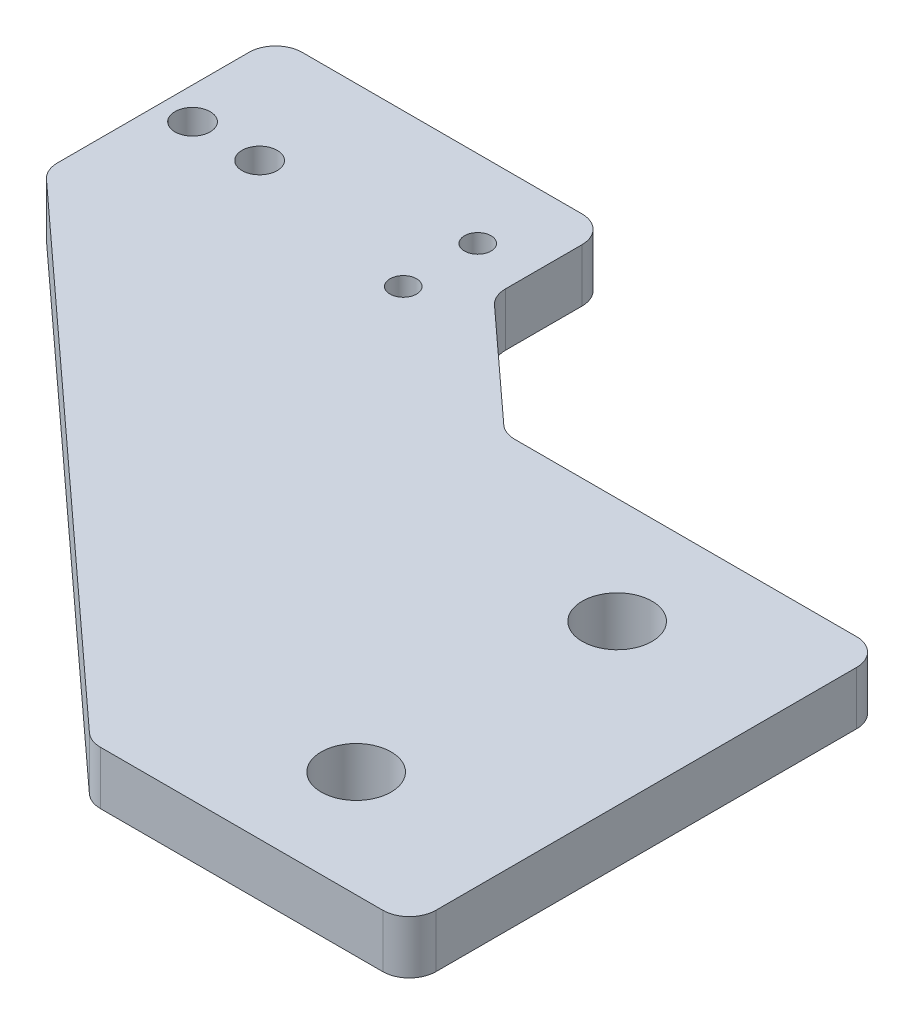
ISO-10303-21;
HEADER;
FILE_DESCRIPTION(('STEP AP214'),'2;1');
FILE_NAME('part.step','',(''),(''),'','','');
FILE_SCHEMA(('AUTOMOTIVE_DESIGN { 1 0 10303 214 1 1 1 1 }'));
ENDSEC;
DATA;
#1=APPLICATION_CONTEXT('core data for automotive mechanical design processes');
#2=APPLICATION_PROTOCOL_DEFINITION('international standard','automotive_design',2000,#1);
#3=PRODUCT_CONTEXT('',#1,'mechanical');
#4=PRODUCT('Part','Part','',(#3));
#5=PRODUCT_RELATED_PRODUCT_CATEGORY('part','',(#4));
#6=PRODUCT_DEFINITION_FORMATION('','',#4);
#7=PRODUCT_DEFINITION_CONTEXT('part definition',#1,'design');
#8=PRODUCT_DEFINITION('design','',#6,#7);
#9=PRODUCT_DEFINITION_SHAPE('','',#8);
#10=(LENGTH_UNIT() NAMED_UNIT(*) SI_UNIT(.MILLI.,.METRE.));
#11=(NAMED_UNIT(*) PLANE_ANGLE_UNIT() SI_UNIT($,.RADIAN.));
#12=(NAMED_UNIT(*) SI_UNIT($,.STERADIAN.) SOLID_ANGLE_UNIT());
#13=UNCERTAINTY_MEASURE_WITH_UNIT(LENGTH_MEASURE(1.E-05),#10,'distance_accuracy_value','');
#14=(GEOMETRIC_REPRESENTATION_CONTEXT(3) GLOBAL_UNCERTAINTY_ASSIGNED_CONTEXT((#13)) GLOBAL_UNIT_ASSIGNED_CONTEXT((#10,
#11,#12)) REPRESENTATION_CONTEXT('',''));
#15=CARTESIAN_POINT('',(0.,0.,0.));
#16=DIRECTION('',(0.,0.,1.));
#17=DIRECTION('',(1.,0.,0.));
#18=AXIS2_PLACEMENT_3D('',#15,#16,#17);
#19=CARTESIAN_POINT('',(628.65,-25.4000000000002,534.61));
#20=DIRECTION('',(1.,0.,0.));
#21=DIRECTION('',(0.,0.,-1.));
#22=AXIS2_PLACEMENT_3D('',#19,#20,#21);
#23=PLANE('',#22);
#24=DIRECTION('',(0.,0.,-1.));
#25=VECTOR('',#24,1.);
#26=CARTESIAN_POINT('',(628.65,-19.0500000000002,534.61));
#27=LINE('',#26,#25);
#28=CARTESIAN_POINT('',(628.65,-19.0500000000002,587.98));
#29=VERTEX_POINT('',#28);
#30=CARTESIAN_POINT('',(628.65,-19.0500000000002,537.785));
#31=VERTEX_POINT('',#30);
#32=EDGE_CURVE('E273',#29,#31,#27,.T.);
#33=ORIENTED_EDGE('',*,*,#32,.F.);
#34=DIRECTION('',(0.,1.,0.));
#35=VECTOR('',#34,1.);
#36=CARTESIAN_POINT('',(628.65,-25.4000000000002,587.98));
#37=LINE('',#36,#35);
#38=CARTESIAN_POINT('',(628.65,-25.4000000000002,587.98));
#39=VERTEX_POINT('',#38);
#40=EDGE_CURVE('E193',#29,#39,#37,.F.);
#41=ORIENTED_EDGE('',*,*,#40,.T.);
#42=DIRECTION('',(0.,0.,-1.));
#43=VECTOR('',#42,1.);
#44=CARTESIAN_POINT('',(628.65,-25.4000000000002,534.61));
#45=LINE('',#44,#43);
#46=CARTESIAN_POINT('',(628.65,-25.4000000000002,537.785));
#47=VERTEX_POINT('',#46);
#48=EDGE_CURVE('E170',#39,#47,#45,.T.);
#49=ORIENTED_EDGE('',*,*,#48,.T.);
#50=DIRECTION('',(0.,1.,0.));
#51=VECTOR('',#50,1.);
#52=CARTESIAN_POINT('',(628.65,-25.4000000000002,537.785));
#53=LINE('',#52,#51);
#54=EDGE_CURVE('E190',#47,#31,#53,.T.);
#55=ORIENTED_EDGE('',*,*,#54,.T.);
#56=EDGE_LOOP('',(#33,#41,#49,#55));
#57=FACE_BOUND('',#56,.T.);
#58=ADVANCED_FACE('F34',(#57),#23,.T.);
#59=CARTESIAN_POINT('',(590.55,-25.4000000000002,591.155));
#60=DIRECTION('',(0.,0.,1.));
#61=DIRECTION('',(1.,0.,0.));
#62=AXIS2_PLACEMENT_3D('',#59,#60,#61);
#63=PLANE('',#62);
#64=DIRECTION('',(1.,0.,0.));
#65=VECTOR('',#64,1.);
#66=CARTESIAN_POINT('',(590.55,-25.4000000000002,591.155));
#67=LINE('',#66,#65);
#68=CARTESIAN_POINT('',(591.782523891096,-25.4000000000002,591.155));
#69=VERTEX_POINT('',#68);
#70=CARTESIAN_POINT('',(625.475,-25.4000000000002,591.155));
#71=VERTEX_POINT('',#70);
#72=EDGE_CURVE('E175',#69,#71,#67,.T.);
#73=ORIENTED_EDGE('',*,*,#72,.T.);
#74=DIRECTION('',(0.,1.,0.));
#75=VECTOR('',#74,1.);
#76=CARTESIAN_POINT('',(625.475,-25.4000000000002,591.155));
#77=LINE('',#76,#75);
#78=CARTESIAN_POINT('',(625.475,-19.0500000000002,591.155));
#79=VERTEX_POINT('',#78);
#80=EDGE_CURVE('E169',#71,#79,#77,.T.);
#81=ORIENTED_EDGE('',*,*,#80,.T.);
#82=DIRECTION('',(1.,0.,0.));
#83=VECTOR('',#82,1.);
#84=CARTESIAN_POINT('',(590.55,-19.0500000000002,591.155));
#85=LINE('',#84,#83);
#86=CARTESIAN_POINT('',(591.782523891096,-19.0500000000002,591.155));
#87=VERTEX_POINT('',#86);
#88=EDGE_CURVE('E152',#87,#79,#85,.T.);
#89=ORIENTED_EDGE('',*,*,#88,.F.);
#90=DIRECTION('',(0.,1.,0.));
#91=VECTOR('',#90,1.);
#92=CARTESIAN_POINT('',(591.782523891096,-25.4000000000002,591.155));
#93=LINE('',#92,#91);
#94=EDGE_CURVE('E166',#87,#69,#93,.F.);
#95=ORIENTED_EDGE('',*,*,#94,.T.);
#96=EDGE_LOOP('',(#73,#81,#89,#95));
#97=FACE_BOUND('',#96,.T.);
#98=ADVANCED_FACE('F165',(#97),#63,.T.);
#99=CARTESIAN_POINT('',(528.83,-25.4000000000002,534.7335));
#100=DIRECTION('',(-0.674715692986946,0.,0.738077728723164));
#101=DIRECTION('',(0.738077728723164,0.,0.674715692986946));
#102=AXIS2_PLACEMENT_3D('',#99,#100,#101);
#103=PLANE('',#102);
#104=DIRECTION('',(0.738077728723164,0.,0.674715692986946));
#105=VECTOR('',#104,1.);
#106=CARTESIAN_POINT('',(528.83,-25.4000000000002,534.7335));
#107=LINE('',#106,#105);
#108=CARTESIAN_POINT('',(529.862777674767,-25.4000000000002,535.677616422178));
#109=VERTEX_POINT('',#108);
#110=CARTESIAN_POINT('',(589.640301565863,-25.4000000000002,590.323396788696));
#111=VERTEX_POINT('',#110);
#112=EDGE_CURVE('E179',#109,#111,#107,.T.);
#113=ORIENTED_EDGE('',*,*,#112,.T.);
#114=DIRECTION('',(0.,1.,0.));
#115=VECTOR('',#114,1.);
#116=CARTESIAN_POINT('',(589.640301565863,-25.4000000000002,590.323396788696));
#117=LINE('',#116,#115);
#118=CARTESIAN_POINT('',(589.640301565863,-19.0500000000002,590.323396788696));
#119=VERTEX_POINT('',#118);
#120=EDGE_CURVE('E208',#111,#119,#117,.T.);
#121=ORIENTED_EDGE('',*,*,#120,.T.);
#122=DIRECTION('',(0.738077728723164,0.,0.674715692986946));
#123=VECTOR('',#122,1.);
#124=CARTESIAN_POINT('',(528.83,-19.0500000000002,534.7335));
#125=LINE('',#124,#123);
#126=CARTESIAN_POINT('',(529.862777674767,-19.0500000000002,535.677616422178));
#127=VERTEX_POINT('',#126);
#128=EDGE_CURVE('E154',#127,#119,#125,.T.);
#129=ORIENTED_EDGE('',*,*,#128,.F.);
#130=DIRECTION('',(0.,1.,0.));
#131=VECTOR('',#130,1.);
#132=CARTESIAN_POINT('',(529.862777674767,-25.4000000000002,535.677616422178));
#133=LINE('',#132,#131);
#134=EDGE_CURVE('E206',#127,#109,#133,.F.);
#135=ORIENTED_EDGE('',*,*,#134,.T.);
#136=EDGE_LOOP('',(#113,#121,#129,#135));
#137=FACE_BOUND('',#136,.T.);
#138=ADVANCED_FACE('F373',(#137),#103,.T.);
#139=CARTESIAN_POINT('',(528.83,-25.4000000000002,534.7335));
#140=DIRECTION('',(-1.,0.,0.));
#141=DIRECTION('',(0.,0.,1.));
#142=AXIS2_PLACEMENT_3D('',#139,#140,#141);
#143=PLANE('',#142);
#144=DIRECTION('',(0.,0.,1.));
#145=VECTOR('',#144,1.);
#146=CARTESIAN_POINT('',(528.83,-25.4000000000002,534.7335));
#147=LINE('',#146,#145);
#148=CARTESIAN_POINT('',(528.83,-25.4000000000002,510.4765));
#149=VERTEX_POINT('',#148);
#150=CARTESIAN_POINT('',(528.83,-25.4000000000002,533.334219633482));
#151=VERTEX_POINT('',#150);
#152=EDGE_CURVE('E289',#149,#151,#147,.T.);
#153=ORIENTED_EDGE('',*,*,#152,.T.);
#154=DIRECTION('',(0.,1.,0.));
#155=VECTOR('',#154,1.);
#156=CARTESIAN_POINT('',(528.83,-25.4000000000002,533.334219633482));
#157=LINE('',#156,#155);
#158=CARTESIAN_POINT('',(528.83,-19.0500000000002,533.334219633482));
#159=VERTEX_POINT('',#158);
#160=EDGE_CURVE('E226',#151,#159,#157,.T.);
#161=ORIENTED_EDGE('',*,*,#160,.T.);
#162=DIRECTION('',(0.,0.,1.));
#163=VECTOR('',#162,1.);
#164=CARTESIAN_POINT('',(528.83,-19.0500000000002,534.7335));
#165=LINE('',#164,#163);
#166=CARTESIAN_POINT('',(528.83,-19.0500000000002,510.4765));
#167=VERTEX_POINT('',#166);
#168=EDGE_CURVE('E308',#167,#159,#165,.T.);
#169=ORIENTED_EDGE('',*,*,#168,.F.);
#170=DIRECTION('',(0.,1.,0.));
#171=VECTOR('',#170,1.);
#172=CARTESIAN_POINT('',(528.83,-25.4000000000002,510.4765));
#173=LINE('',#172,#171);
#174=EDGE_CURVE('E224',#167,#149,#173,.F.);
#175=ORIENTED_EDGE('',*,*,#174,.T.);
#176=EDGE_LOOP('',(#153,#161,#169,#175));
#177=FACE_BOUND('',#176,.T.);
#178=ADVANCED_FACE('F313',(#177),#143,.T.);
#179=CARTESIAN_POINT('',(528.83,-25.4000000000002,507.3015));
#180=DIRECTION('',(0.,0.,-1.));
#181=DIRECTION('',(-1.,0.,0.));
#182=AXIS2_PLACEMENT_3D('',#179,#180,#181);
#183=PLANE('',#182);
#184=DIRECTION('',(-1.,0.,0.));
#185=VECTOR('',#184,1.);
#186=CARTESIAN_POINT('',(552.45,-25.4000000000002,507.3015));
#187=LINE('',#186,#185);
#188=CARTESIAN_POINT('',(565.405,-25.4000000000002,507.3015));
#189=VERTEX_POINT('',#188);
#190=CARTESIAN_POINT('',(532.005,-25.4000000000002,507.3015));
#191=VERTEX_POINT('',#190);
#192=EDGE_CURVE('E286',#189,#191,#187,.T.);
#193=ORIENTED_EDGE('',*,*,#192,.T.);
#194=DIRECTION('',(0.,1.,0.));
#195=VECTOR('',#194,1.);
#196=CARTESIAN_POINT('',(532.005,-25.4000000000002,507.3015));
#197=LINE('',#196,#195);
#198=CARTESIAN_POINT('',(532.005,-19.0500000000002,507.3015));
#199=VERTEX_POINT('',#198);
#200=EDGE_CURVE('E231',#191,#199,#197,.T.);
#201=ORIENTED_EDGE('',*,*,#200,.T.);
#202=DIRECTION('',(-1.,0.,0.));
#203=VECTOR('',#202,1.);
#204=CARTESIAN_POINT('',(528.83,-19.0500000000002,507.3015));
#205=LINE('',#204,#203);
#206=CARTESIAN_POINT('',(565.405,-19.0500000000002,507.3015));
#207=VERTEX_POINT('',#206);
#208=EDGE_CURVE('E305',#207,#199,#205,.T.);
#209=ORIENTED_EDGE('',*,*,#208,.F.);
#210=DIRECTION('',(0.,1.,0.));
#211=VECTOR('',#210,1.);
#212=CARTESIAN_POINT('',(565.405,-25.4000000000002,507.3015));
#213=LINE('',#212,#211);
#214=EDGE_CURVE('E229',#207,#189,#213,.F.);
#215=ORIENTED_EDGE('',*,*,#214,.T.);
#216=EDGE_LOOP('',(#193,#201,#209,#215));
#217=FACE_BOUND('',#216,.T.);
#218=ADVANCED_FACE('F325',(#217),#183,.T.);
#219=CARTESIAN_POINT('',(568.58,-25.4000000000002,507.3015));
#220=DIRECTION('',(1.,0.,0.));
#221=DIRECTION('',(0.,0.,-1.));
#222=AXIS2_PLACEMENT_3D('',#219,#220,#221);
#223=PLANE('',#222);
#224=DIRECTION('',(0.,0.,-1.));
#225=VECTOR('',#224,1.);
#226=CARTESIAN_POINT('',(568.58,-19.0500000000002,507.3015));
#227=LINE('',#226,#225);
#228=CARTESIAN_POINT('',(568.58,-19.0500000000002,519.618219633482));
#229=VERTEX_POINT('',#228);
#230=CARTESIAN_POINT('',(568.58,-19.0500000000002,510.4765));
#231=VERTEX_POINT('',#230);
#232=EDGE_CURVE('E302',#229,#231,#227,.T.);
#233=ORIENTED_EDGE('',*,*,#232,.F.);
#234=DIRECTION('',(0.,1.,0.));
#235=VECTOR('',#234,1.);
#236=CARTESIAN_POINT('',(568.58,-25.4000000000002,519.618219633482));
#237=LINE('',#236,#235);
#238=CARTESIAN_POINT('',(568.58,-25.4000000000002,519.618219633482));
#239=VERTEX_POINT('',#238);
#240=EDGE_CURVE('E222',#229,#239,#237,.F.);
#241=ORIENTED_EDGE('',*,*,#240,.T.);
#242=DIRECTION('',(0.,0.,-1.));
#243=VECTOR('',#242,1.);
#244=CARTESIAN_POINT('',(568.58,-25.4000000000002,507.3015));
#245=LINE('',#244,#243);
#246=CARTESIAN_POINT('',(568.58,-25.4000000000002,510.4765));
#247=VERTEX_POINT('',#246);
#248=EDGE_CURVE('E283',#239,#247,#245,.T.);
#249=ORIENTED_EDGE('',*,*,#248,.T.);
#250=DIRECTION('',(0.,1.,0.));
#251=VECTOR('',#250,1.);
#252=CARTESIAN_POINT('',(568.58,-25.4000000000002,510.4765));
#253=LINE('',#252,#251);
#254=EDGE_CURVE('E219',#247,#231,#253,.T.);
#255=ORIENTED_EDGE('',*,*,#254,.T.);
#256=EDGE_LOOP('',(#233,#241,#249,#255));
#257=FACE_BOUND('',#256,.T.);
#258=ADVANCED_FACE('F334',(#257),#223,.T.);
#259=CARTESIAN_POINT('',(568.58,-25.4000000000002,521.0175));
#260=DIRECTION('',(0.674715692986948,0.,-0.738077728723162));
#261=DIRECTION('',(-0.738077728723162,0.,-0.674715692986948));
#262=AXIS2_PLACEMENT_3D('',#259,#260,#261);
#263=PLANE('',#262);
#264=DIRECTION('',(-0.738077728723162,0.,-0.674715692986948));
#265=VECTOR('',#264,1.);
#266=CARTESIAN_POINT('',(568.58,-25.4000000000002,521.0175));
#267=LINE('',#266,#265);
#268=CARTESIAN_POINT('',(582.539262866076,-25.4000000000002,533.778396788696));
#269=VERTEX_POINT('',#268);
#270=CARTESIAN_POINT('',(569.612777674767,-25.4000000000002,521.961616422178));
#271=VERTEX_POINT('',#270);
#272=EDGE_CURVE('E280',#269,#271,#267,.T.);
#273=ORIENTED_EDGE('',*,*,#272,.T.);
#274=DIRECTION('',(0.,1.,0.));
#275=VECTOR('',#274,1.);
#276=CARTESIAN_POINT('',(569.612777674767,-19.0500000000002,521.961616422178));
#277=LINE('',#276,#275);
#278=CARTESIAN_POINT('',(569.612777674767,-19.0500000000002,521.961616422178));
#279=VERTEX_POINT('',#278);
#280=EDGE_CURVE('E216',#271,#279,#277,.T.);
#281=ORIENTED_EDGE('',*,*,#280,.T.);
#282=DIRECTION('',(-0.738077728723162,0.,-0.674715692986948));
#283=VECTOR('',#282,1.);
#284=CARTESIAN_POINT('',(568.58,-19.0500000000002,521.0175));
#285=LINE('',#284,#283);
#286=CARTESIAN_POINT('',(582.539262866076,-19.0500000000002,533.778396788696));
#287=VERTEX_POINT('',#286);
#288=EDGE_CURVE('E299',#287,#279,#285,.T.);
#289=ORIENTED_EDGE('',*,*,#288,.F.);
#290=DIRECTION('',(0.,1.,0.));
#291=VECTOR('',#290,1.);
#292=CARTESIAN_POINT('',(582.539262866076,-25.4000000000002,533.778396788696));
#293=LINE('',#292,#291);
#294=EDGE_CURVE('E214',#287,#269,#293,.F.);
#295=ORIENTED_EDGE('',*,*,#294,.T.);
#296=EDGE_LOOP('',(#273,#281,#289,#295));
#297=FACE_BOUND('',#296,.T.);
#298=ADVANCED_FACE('F340',(#297),#263,.T.);
#299=CARTESIAN_POINT('',(583.448961300214,-25.4000000000002,534.61));
#300=DIRECTION('',(0.,0.,-1.));
#301=DIRECTION('',(-1.,0.,0.));
#302=AXIS2_PLACEMENT_3D('',#299,#300,#301);
#303=PLANE('',#302);
#304=DIRECTION('',(-1.,0.,0.));
#305=VECTOR('',#304,1.);
#306=CARTESIAN_POINT('',(583.448961300214,-19.0500000000002,534.61));
#307=LINE('',#306,#305);
#308=CARTESIAN_POINT('',(625.475,-19.0500000000002,534.61));
#309=VERTEX_POINT('',#308);
#310=CARTESIAN_POINT('',(584.68148519131,-19.0500000000002,534.61));
#311=VERTEX_POINT('',#310);
#312=EDGE_CURVE('E296',#309,#311,#307,.T.);
#313=ORIENTED_EDGE('',*,*,#312,.F.);
#314=DIRECTION('',(0.,1.,0.));
#315=VECTOR('',#314,1.);
#316=CARTESIAN_POINT('',(625.475,-25.4000000000002,534.61));
#317=LINE('',#316,#315);
#318=CARTESIAN_POINT('',(625.475,-25.4000000000002,534.61));
#319=VERTEX_POINT('',#318);
#320=EDGE_CURVE('E56',#309,#319,#317,.F.);
#321=ORIENTED_EDGE('',*,*,#320,.T.);
#322=DIRECTION('',(-1.,0.,0.));
#323=VECTOR('',#322,1.);
#324=CARTESIAN_POINT('',(583.448961300214,-25.4000000000002,534.61));
#325=LINE('',#324,#323);
#326=CARTESIAN_POINT('',(584.68148519131,-25.4000000000002,534.61));
#327=VERTEX_POINT('',#326);
#328=EDGE_CURVE('E278',#319,#327,#325,.T.);
#329=ORIENTED_EDGE('',*,*,#328,.T.);
#330=DIRECTION('',(0.,1.,0.));
#331=VECTOR('',#330,1.);
#332=CARTESIAN_POINT('',(584.68148519131,-19.0500000000002,534.61));
#333=LINE('',#332,#331);
#334=EDGE_CURVE('E210',#327,#311,#333,.T.);
#335=ORIENTED_EDGE('',*,*,#334,.T.);
#336=EDGE_LOOP('',(#313,#321,#329,#335));
#337=FACE_BOUND('',#336,.T.);
#338=ADVANCED_FACE('F346',(#337),#303,.T.);
#339=CARTESIAN_POINT('',(0.,-25.4000000000002,0.));
#340=DIRECTION('',(0.,1.,0.));
#341=DIRECTION('',(0.,0.,1.));
#342=AXIS2_PLACEMENT_3D('',#339,#340,#341);
#343=PLANE('',#342);
#344=CARTESIAN_POINT('',(609.6,-25.4000000000002,578.455));
#345=DIRECTION('',(0.,1.,0.));
#346=DIRECTION('',(0.,0.,1.));
#347=AXIS2_PLACEMENT_3D('',#344,#345,#346);
#348=CIRCLE('',#347,4.16560000000004);
#349=CARTESIAN_POINT('',(609.6,-25.4000000000002,582.6206));
#350=VERTEX_POINT('',#349);
#351=EDGE_CURVE('E252',#350,#350,#348,.T.);
#352=ORIENTED_EDGE('',*,*,#351,.T.);
#353=EDGE_LOOP('',(#352));
#354=FACE_BOUND('',#353,.T.);
#355=CARTESIAN_POINT('',(609.6,-25.4000000000002,547.31));
#356=DIRECTION('',(0.,1.,0.));
#357=DIRECTION('',(0.,0.,1.));
#358=AXIS2_PLACEMENT_3D('',#355,#356,#357);
#359=CIRCLE('',#358,4.16560000000004);
#360=CARTESIAN_POINT('',(609.6,-25.4000000000002,551.4756));
#361=VERTEX_POINT('',#360);
#362=EDGE_CURVE('E241',#361,#361,#359,.T.);
#363=ORIENTED_EDGE('',*,*,#362,.T.);
#364=EDGE_LOOP('',(#363));
#365=FACE_BOUND('',#364,.T.);
#366=CARTESIAN_POINT('',(540.64,-25.4000000000002,521.0175));
#367=DIRECTION('',(0.,1.,0.));
#368=DIRECTION('',(0.,0.,1.));
#369=AXIS2_PLACEMENT_3D('',#366,#367,#368);
#370=CIRCLE('',#369,2.09999999099999);
#371=CARTESIAN_POINT('',(540.64,-25.4000000000002,523.117499991));
#372=VERTEX_POINT('',#371);
#373=EDGE_CURVE('E245',#372,#372,#370,.T.);
#374=ORIENTED_EDGE('',*,*,#373,.T.);
#375=EDGE_LOOP('',(#374));
#376=FACE_BOUND('',#375,.T.);
#377=CARTESIAN_POINT('',(562.23,-25.4000000000002,525.4625));
#378=DIRECTION('',(0.,1.,0.));
#379=DIRECTION('',(0.,0.,1.));
#380=AXIS2_PLACEMENT_3D('',#377,#378,#379);
#381=CIRCLE('',#380,1.58749999999992);
#382=CARTESIAN_POINT('',(562.23,-25.4000000000002,527.05));
#383=VERTEX_POINT('',#382);
#384=EDGE_CURVE('E258',#383,#383,#381,.T.);
#385=ORIENTED_EDGE('',*,*,#384,.T.);
#386=EDGE_LOOP('',(#385));
#387=FACE_BOUND('',#386,.T.);
#388=CARTESIAN_POINT('',(562.23,-25.4000000000002,516.5725));
#389=DIRECTION('',(0.,1.,0.));
#390=DIRECTION('',(0.,0.,1.));
#391=AXIS2_PLACEMENT_3D('',#388,#389,#390);
#392=CIRCLE('',#391,1.58749999999992);
#393=CARTESIAN_POINT('',(562.23,-25.4000000000002,518.16));
#394=VERTEX_POINT('',#393);
#395=EDGE_CURVE('E264',#394,#394,#392,.T.);
#396=ORIENTED_EDGE('',*,*,#395,.T.);
#397=EDGE_LOOP('',(#396));
#398=FACE_BOUND('',#397,.T.);
#399=CARTESIAN_POINT('',(532.64,-25.4000000000002,521.0175));
#400=DIRECTION('',(0.,1.,0.));
#401=DIRECTION('',(0.,0.,1.));
#402=AXIS2_PLACEMENT_3D('',#399,#400,#401);
#403=CIRCLE('',#402,2.09999999099999);
#404=CARTESIAN_POINT('',(532.64,-25.4000000000002,523.117499991));
#405=VERTEX_POINT('',#404);
#406=EDGE_CURVE('E270',#405,#405,#403,.T.);
#407=ORIENTED_EDGE('',*,*,#406,.T.);
#408=EDGE_LOOP('',(#407));
#409=FACE_BOUND('',#408,.T.);
#410=ORIENTED_EDGE('',*,*,#48,.F.);
#411=CARTESIAN_POINT('',(625.475,-25.4000000000002,587.98));
#412=DIRECTION('',(0.,1.,0.));
#413=DIRECTION('',(0.,0.,1.));
#414=AXIS2_PLACEMENT_3D('',#411,#412,#413);
#415=CIRCLE('',#414,3.175);
#416=EDGE_CURVE('E204',#39,#71,#415,.F.);
#417=ORIENTED_EDGE('',*,*,#416,.T.);
#418=ORIENTED_EDGE('',*,*,#72,.F.);
#419=CARTESIAN_POINT('',(591.782523891096,-25.4000000000002,587.98));
#420=DIRECTION('',(0.,1.,0.));
#421=DIRECTION('',(0.,0.,1.));
#422=AXIS2_PLACEMENT_3D('',#419,#420,#421);
#423=CIRCLE('',#422,3.175);
#424=EDGE_CURVE('E174',#69,#111,#423,.F.);
#425=ORIENTED_EDGE('',*,*,#424,.T.);
#426=ORIENTED_EDGE('',*,*,#112,.F.);
#427=CARTESIAN_POINT('',(532.005,-25.4000000000002,533.334219633482));
#428=DIRECTION('',(0.,1.,0.));
#429=DIRECTION('',(0.,0.,1.));
#430=AXIS2_PLACEMENT_3D('',#427,#428,#429);
#431=CIRCLE('',#430,3.175);
#432=EDGE_CURVE('E199',#109,#151,#431,.F.);
#433=ORIENTED_EDGE('',*,*,#432,.T.);
#434=ORIENTED_EDGE('',*,*,#152,.F.);
#435=CARTESIAN_POINT('',(532.005,-25.4000000000002,510.4765));
#436=DIRECTION('',(0.,1.,0.));
#437=DIRECTION('',(0.,0.,1.));
#438=AXIS2_PLACEMENT_3D('',#435,#436,#437);
#439=CIRCLE('',#438,3.175);
#440=EDGE_CURVE('E197',#149,#191,#439,.F.);
#441=ORIENTED_EDGE('',*,*,#440,.T.);
#442=ORIENTED_EDGE('',*,*,#192,.F.);
#443=CARTESIAN_POINT('',(565.405,-25.4000000000002,510.4765));
#444=DIRECTION('',(0.,1.,0.));
#445=DIRECTION('',(0.,0.,1.));
#446=AXIS2_PLACEMENT_3D('',#443,#444,#445);
#447=CIRCLE('',#446,3.175);
#448=EDGE_CURVE('E195',#189,#247,#447,.F.);
#449=ORIENTED_EDGE('',*,*,#448,.T.);
#450=ORIENTED_EDGE('',*,*,#248,.F.);
#451=CARTESIAN_POINT('',(571.755,-25.4000000000002,519.618219633482));
#452=DIRECTION('',(0.,1.,0.));
#453=DIRECTION('',(0.,0.,1.));
#454=AXIS2_PLACEMENT_3D('',#451,#452,#453);
#455=CIRCLE('',#454,3.175);
#456=EDGE_CURVE('E236',#239,#271,#455,.T.);
#457=ORIENTED_EDGE('',*,*,#456,.T.);
#458=ORIENTED_EDGE('',*,*,#272,.F.);
#459=CARTESIAN_POINT('',(584.68148519131,-25.4000000000002,531.435));
#460=DIRECTION('',(0.,1.,0.));
#461=DIRECTION('',(0.,0.,1.));
#462=AXIS2_PLACEMENT_3D('',#459,#460,#461);
#463=CIRCLE('',#462,3.175);
#464=EDGE_CURVE('E11',#269,#327,#463,.T.);
#465=ORIENTED_EDGE('',*,*,#464,.T.);
#466=ORIENTED_EDGE('',*,*,#328,.F.);
#467=CARTESIAN_POINT('',(625.475,-25.4000000000002,537.785));
#468=DIRECTION('',(0.,1.,0.));
#469=DIRECTION('',(0.,0.,1.));
#470=AXIS2_PLACEMENT_3D('',#467,#468,#469);
#471=CIRCLE('',#470,3.175);
#472=EDGE_CURVE('E201',#319,#47,#471,.F.);
#473=ORIENTED_EDGE('',*,*,#472,.T.);
#474=EDGE_LOOP('',(#410,#417,#418,#425,#426,#433,#434,#441,#442,#449,#450,#457,#458,#465,#466,#473));
#475=FACE_BOUND('',#474,.T.);
#476=ADVANCED_FACE('F322',(#354,#365,#376,#387,#398,#409,#475),#343,.F.);
#477=CARTESIAN_POINT('',(0.,-19.0500000000002,0.));
#478=DIRECTION('',(0.,1.,0.));
#479=DIRECTION('',(0.,0.,1.));
#480=AXIS2_PLACEMENT_3D('',#477,#478,#479);
#481=PLANE('',#480);
#482=CARTESIAN_POINT('',(609.6,-19.0500000000002,578.455));
#483=DIRECTION('',(0.,1.,0.));
#484=DIRECTION('',(0.,0.,1.));
#485=AXIS2_PLACEMENT_3D('',#482,#483,#484);
#486=CIRCLE('',#485,4.16560000000004);
#487=CARTESIAN_POINT('',(609.6,-19.0500000000002,582.6206));
#488=VERTEX_POINT('',#487);
#489=EDGE_CURVE('E38',#488,#488,#486,.T.);
#490=ORIENTED_EDGE('',*,*,#489,.F.);
#491=EDGE_LOOP('',(#490));
#492=FACE_BOUND('',#491,.T.);
#493=CARTESIAN_POINT('',(609.6,-19.0500000000002,547.31));
#494=DIRECTION('',(0.,1.,0.));
#495=DIRECTION('',(0.,0.,1.));
#496=AXIS2_PLACEMENT_3D('',#493,#494,#495);
#497=CIRCLE('',#496,4.16560000000004);
#498=CARTESIAN_POINT('',(609.6,-19.0500000000002,551.4756));
#499=VERTEX_POINT('',#498);
#500=EDGE_CURVE('E238',#499,#499,#497,.T.);
#501=ORIENTED_EDGE('',*,*,#500,.F.);
#502=EDGE_LOOP('',(#501));
#503=FACE_BOUND('',#502,.T.);
#504=CARTESIAN_POINT('',(540.64,-19.0500000000002,521.0175));
#505=DIRECTION('',(0.,1.,0.));
#506=DIRECTION('',(0.,0.,1.));
#507=AXIS2_PLACEMENT_3D('',#504,#505,#506);
#508=CIRCLE('',#507,2.09999999099999);
#509=CARTESIAN_POINT('',(540.64,-19.0500000000002,523.117499991));
#510=VERTEX_POINT('',#509);
#511=EDGE_CURVE('E240',#510,#510,#508,.T.);
#512=ORIENTED_EDGE('',*,*,#511,.F.);
#513=EDGE_LOOP('',(#512));
#514=FACE_BOUND('',#513,.T.);
#515=CARTESIAN_POINT('',(562.23,-19.0500000000002,525.4625));
#516=DIRECTION('',(0.,1.,0.));
#517=DIRECTION('',(0.,0.,1.));
#518=AXIS2_PLACEMENT_3D('',#515,#516,#517);
#519=CIRCLE('',#518,1.58749999999992);
#520=CARTESIAN_POINT('',(562.23,-19.0500000000002,527.05));
#521=VERTEX_POINT('',#520);
#522=EDGE_CURVE('E256',#521,#521,#519,.T.);
#523=ORIENTED_EDGE('',*,*,#522,.F.);
#524=EDGE_LOOP('',(#523));
#525=FACE_BOUND('',#524,.T.);
#526=CARTESIAN_POINT('',(562.23,-19.0500000000002,516.5725));
#527=DIRECTION('',(0.,1.,0.));
#528=DIRECTION('',(0.,0.,1.));
#529=AXIS2_PLACEMENT_3D('',#526,#527,#528);
#530=CIRCLE('',#529,1.58749999999992);
#531=CARTESIAN_POINT('',(562.23,-19.0500000000002,518.16));
#532=VERTEX_POINT('',#531);
#533=EDGE_CURVE('E261',#532,#532,#530,.T.);
#534=ORIENTED_EDGE('',*,*,#533,.F.);
#535=EDGE_LOOP('',(#534));
#536=FACE_BOUND('',#535,.T.);
#537=CARTESIAN_POINT('',(532.64,-19.0500000000002,521.0175));
#538=DIRECTION('',(0.,1.,0.));
#539=DIRECTION('',(0.,0.,1.));
#540=AXIS2_PLACEMENT_3D('',#537,#538,#539);
#541=CIRCLE('',#540,2.09999999099999);
#542=CARTESIAN_POINT('',(532.64,-19.0500000000002,523.117499991));
#543=VERTEX_POINT('',#542);
#544=EDGE_CURVE('E267',#543,#543,#541,.T.);
#545=ORIENTED_EDGE('',*,*,#544,.F.);
#546=EDGE_LOOP('',(#545));
#547=FACE_BOUND('',#546,.T.);
#548=ORIENTED_EDGE('',*,*,#88,.T.);
#549=CARTESIAN_POINT('',(625.475,-19.0500000000002,587.98));
#550=DIRECTION('',(0.,1.,0.));
#551=DIRECTION('',(0.,0.,1.));
#552=AXIS2_PLACEMENT_3D('',#549,#550,#551);
#553=CIRCLE('',#552,3.175);
#554=EDGE_CURVE('E159',#79,#29,#553,.T.);
#555=ORIENTED_EDGE('',*,*,#554,.T.);
#556=ORIENTED_EDGE('',*,*,#32,.T.);
#557=CARTESIAN_POINT('',(625.475,-19.0500000000002,537.785));
#558=DIRECTION('',(0.,1.,0.));
#559=DIRECTION('',(0.,0.,1.));
#560=AXIS2_PLACEMENT_3D('',#557,#558,#559);
#561=CIRCLE('',#560,3.175);
#562=EDGE_CURVE('E160',#31,#309,#561,.T.);
#563=ORIENTED_EDGE('',*,*,#562,.T.);
#564=ORIENTED_EDGE('',*,*,#312,.T.);
#565=CARTESIAN_POINT('',(584.68148519131,-19.0500000000002,531.435));
#566=DIRECTION('',(0.,1.,0.));
#567=DIRECTION('',(0.,0.,1.));
#568=AXIS2_PLACEMENT_3D('',#565,#566,#567);
#569=CIRCLE('',#568,3.175);
#570=EDGE_CURVE('E43',#311,#287,#569,.F.);
#571=ORIENTED_EDGE('',*,*,#570,.T.);
#572=ORIENTED_EDGE('',*,*,#288,.T.);
#573=CARTESIAN_POINT('',(571.755,-19.0500000000002,519.618219633482));
#574=DIRECTION('',(0.,1.,0.));
#575=DIRECTION('',(0.,0.,1.));
#576=AXIS2_PLACEMENT_3D('',#573,#574,#575);
#577=CIRCLE('',#576,3.175);
#578=EDGE_CURVE('E234',#279,#229,#577,.F.);
#579=ORIENTED_EDGE('',*,*,#578,.T.);
#580=ORIENTED_EDGE('',*,*,#232,.T.);
#581=CARTESIAN_POINT('',(565.405,-19.0500000000002,510.4765));
#582=DIRECTION('',(0.,1.,0.));
#583=DIRECTION('',(0.,0.,1.));
#584=AXIS2_PLACEMENT_3D('',#581,#582,#583);
#585=CIRCLE('',#584,3.175);
#586=EDGE_CURVE('E177',#231,#207,#585,.T.);
#587=ORIENTED_EDGE('',*,*,#586,.T.);
#588=ORIENTED_EDGE('',*,*,#208,.T.);
#589=CARTESIAN_POINT('',(532.005,-19.0500000000002,510.4765));
#590=DIRECTION('',(0.,1.,0.));
#591=DIRECTION('',(0.,0.,1.));
#592=AXIS2_PLACEMENT_3D('',#589,#590,#591);
#593=CIRCLE('',#592,3.175);
#594=EDGE_CURVE('E184',#199,#167,#593,.T.);
#595=ORIENTED_EDGE('',*,*,#594,.T.);
#596=ORIENTED_EDGE('',*,*,#168,.T.);
#597=CARTESIAN_POINT('',(532.005,-19.0500000000002,533.334219633482));
#598=DIRECTION('',(0.,1.,0.));
#599=DIRECTION('',(0.,0.,1.));
#600=AXIS2_PLACEMENT_3D('',#597,#598,#599);
#601=CIRCLE('',#600,3.175);
#602=EDGE_CURVE('E186',#159,#127,#601,.T.);
#603=ORIENTED_EDGE('',*,*,#602,.T.);
#604=ORIENTED_EDGE('',*,*,#128,.T.);
#605=CARTESIAN_POINT('',(591.782523891096,-19.0500000000002,587.98));
#606=DIRECTION('',(0.,1.,0.));
#607=DIRECTION('',(0.,0.,1.));
#608=AXIS2_PLACEMENT_3D('',#605,#606,#607);
#609=CIRCLE('',#608,3.175);
#610=EDGE_CURVE('E149',#119,#87,#609,.T.);
#611=ORIENTED_EDGE('',*,*,#610,.T.);
#612=EDGE_LOOP('',(#548,#555,#556,#563,#564,#571,#572,#579,#580,#587,#588,#595,#596,#603,#604,#611));
#613=FACE_BOUND('',#612,.T.);
#614=ADVANCED_FACE('F151',(#492,#503,#514,#525,#536,#547,#613),#481,.T.);
#615=CARTESIAN_POINT('',(532.64,-25.4000000000002,521.0175));
#616=DIRECTION('',(0.,1.,0.));
#617=DIRECTION('',(0.,0.,1.));
#618=AXIS2_PLACEMENT_3D('',#615,#616,#617);
#619=CYLINDRICAL_SURFACE('',#618,2.09999999099999);
#620=ORIENTED_EDGE('',*,*,#406,.F.);
#621=EDGE_LOOP('',(#620));
#622=FACE_BOUND('',#621,.T.);
#623=ORIENTED_EDGE('',*,*,#544,.T.);
#624=EDGE_LOOP('',(#623));
#625=FACE_BOUND('',#624,.T.);
#626=ADVANCED_FACE('F391',(#622,#625),#619,.F.);
#627=CARTESIAN_POINT('',(562.23,-25.4000000000002,516.5725));
#628=DIRECTION('',(0.,1.,0.));
#629=DIRECTION('',(0.,0.,1.));
#630=AXIS2_PLACEMENT_3D('',#627,#628,#629);
#631=CYLINDRICAL_SURFACE('',#630,1.58749999999992);
#632=ORIENTED_EDGE('',*,*,#395,.F.);
#633=EDGE_LOOP('',(#632));
#634=FACE_BOUND('',#633,.T.);
#635=ORIENTED_EDGE('',*,*,#533,.T.);
#636=EDGE_LOOP('',(#635));
#637=FACE_BOUND('',#636,.T.);
#638=ADVANCED_FACE('F398',(#634,#637),#631,.F.);
#639=CARTESIAN_POINT('',(562.23,-25.4000000000002,525.4625));
#640=DIRECTION('',(0.,1.,0.));
#641=DIRECTION('',(0.,0.,1.));
#642=AXIS2_PLACEMENT_3D('',#639,#640,#641);
#643=CYLINDRICAL_SURFACE('',#642,1.58749999999992);
#644=ORIENTED_EDGE('',*,*,#384,.F.);
#645=EDGE_LOOP('',(#644));
#646=FACE_BOUND('',#645,.T.);
#647=ORIENTED_EDGE('',*,*,#522,.T.);
#648=EDGE_LOOP('',(#647));
#649=FACE_BOUND('',#648,.T.);
#650=ADVANCED_FACE('F365',(#646,#649),#643,.F.);
#651=CARTESIAN_POINT('',(540.64,-25.4000000000002,521.0175));
#652=DIRECTION('',(0.,1.,0.));
#653=DIRECTION('',(0.,0.,1.));
#654=AXIS2_PLACEMENT_3D('',#651,#652,#653);
#655=CYLINDRICAL_SURFACE('',#654,2.09999999099999);
#656=ORIENTED_EDGE('',*,*,#373,.F.);
#657=EDGE_LOOP('',(#656));
#658=FACE_BOUND('',#657,.T.);
#659=ORIENTED_EDGE('',*,*,#511,.T.);
#660=EDGE_LOOP('',(#659));
#661=FACE_BOUND('',#660,.T.);
#662=ADVANCED_FACE('F358',(#658,#661),#655,.F.);
#663=CARTESIAN_POINT('',(625.475,-25.4000000000002,587.98));
#664=DIRECTION('',(0.,1.,0.));
#665=DIRECTION('',(0.,0.,1.));
#666=AXIS2_PLACEMENT_3D('',#663,#664,#665);
#667=CYLINDRICAL_SURFACE('',#666,3.175);
#668=ORIENTED_EDGE('',*,*,#416,.F.);
#669=ORIENTED_EDGE('',*,*,#40,.F.);
#670=ORIENTED_EDGE('',*,*,#554,.F.);
#671=ORIENTED_EDGE('',*,*,#80,.F.);
#672=EDGE_LOOP('',(#668,#669,#670,#671));
#673=FACE_BOUND('',#672,.T.);
#674=ADVANCED_FACE('F356',(#673),#667,.T.);
#675=CARTESIAN_POINT('',(591.782523891096,-25.4000000000002,587.98));
#676=DIRECTION('',(0.,1.,0.));
#677=DIRECTION('',(0.,0.,1.));
#678=AXIS2_PLACEMENT_3D('',#675,#676,#677);
#679=CYLINDRICAL_SURFACE('',#678,3.175);
#680=ORIENTED_EDGE('',*,*,#424,.F.);
#681=ORIENTED_EDGE('',*,*,#94,.F.);
#682=ORIENTED_EDGE('',*,*,#610,.F.);
#683=ORIENTED_EDGE('',*,*,#120,.F.);
#684=EDGE_LOOP('',(#680,#681,#682,#683));
#685=FACE_BOUND('',#684,.T.);
#686=ADVANCED_FACE('F173',(#685),#679,.T.);
#687=CARTESIAN_POINT('',(625.475,-25.4000000000002,537.785));
#688=DIRECTION('',(0.,1.,0.));
#689=DIRECTION('',(0.,0.,1.));
#690=AXIS2_PLACEMENT_3D('',#687,#688,#689);
#691=CYLINDRICAL_SURFACE('',#690,3.175);
#692=ORIENTED_EDGE('',*,*,#472,.F.);
#693=ORIENTED_EDGE('',*,*,#320,.F.);
#694=ORIENTED_EDGE('',*,*,#562,.F.);
#695=ORIENTED_EDGE('',*,*,#54,.F.);
#696=EDGE_LOOP('',(#692,#693,#694,#695));
#697=FACE_BOUND('',#696,.T.);
#698=ADVANCED_FACE('F351',(#697),#691,.T.);
#699=CARTESIAN_POINT('',(571.755,-25.4000000000002,519.618219633482));
#700=DIRECTION('',(0.,-1.,0.));
#701=DIRECTION('',(0.,0.,-1.));
#702=AXIS2_PLACEMENT_3D('',#699,#700,#701);
#703=CYLINDRICAL_SURFACE('',#702,3.175);
#704=ORIENTED_EDGE('',*,*,#456,.F.);
#705=ORIENTED_EDGE('',*,*,#240,.F.);
#706=ORIENTED_EDGE('',*,*,#578,.F.);
#707=ORIENTED_EDGE('',*,*,#280,.F.);
#708=EDGE_LOOP('',(#704,#705,#706,#707));
#709=FACE_BOUND('',#708,.T.);
#710=ADVANCED_FACE('F337',(#709),#703,.F.);
#711=CARTESIAN_POINT('',(584.68148519131,-25.4000000000002,531.435));
#712=DIRECTION('',(0.,-1.,0.));
#713=DIRECTION('',(0.,0.,-1.));
#714=AXIS2_PLACEMENT_3D('',#711,#712,#713);
#715=CYLINDRICAL_SURFACE('',#714,3.175);
#716=ORIENTED_EDGE('',*,*,#464,.F.);
#717=ORIENTED_EDGE('',*,*,#294,.F.);
#718=ORIENTED_EDGE('',*,*,#570,.F.);
#719=ORIENTED_EDGE('',*,*,#334,.F.);
#720=EDGE_LOOP('',(#716,#717,#718,#719));
#721=FACE_BOUND('',#720,.T.);
#722=ADVANCED_FACE('F344',(#721),#715,.F.);
#723=CARTESIAN_POINT('',(532.005,-25.4000000000002,533.334219633482));
#724=DIRECTION('',(0.,1.,0.));
#725=DIRECTION('',(0.,0.,1.));
#726=AXIS2_PLACEMENT_3D('',#723,#724,#725);
#727=CYLINDRICAL_SURFACE('',#726,3.175);
#728=ORIENTED_EDGE('',*,*,#432,.F.);
#729=ORIENTED_EDGE('',*,*,#134,.F.);
#730=ORIENTED_EDGE('',*,*,#602,.F.);
#731=ORIENTED_EDGE('',*,*,#160,.F.);
#732=EDGE_LOOP('',(#728,#729,#730,#731));
#733=FACE_BOUND('',#732,.T.);
#734=ADVANCED_FACE('F456',(#733),#727,.T.);
#735=CARTESIAN_POINT('',(532.005,-25.4000000000002,510.4765));
#736=DIRECTION('',(0.,1.,0.));
#737=DIRECTION('',(0.,0.,1.));
#738=AXIS2_PLACEMENT_3D('',#735,#736,#737);
#739=CYLINDRICAL_SURFACE('',#738,3.175);
#740=ORIENTED_EDGE('',*,*,#440,.F.);
#741=ORIENTED_EDGE('',*,*,#174,.F.);
#742=ORIENTED_EDGE('',*,*,#594,.F.);
#743=ORIENTED_EDGE('',*,*,#200,.F.);
#744=EDGE_LOOP('',(#740,#741,#742,#743));
#745=FACE_BOUND('',#744,.T.);
#746=ADVANCED_FACE('F318',(#745),#739,.T.);
#747=CARTESIAN_POINT('',(565.405,-25.4000000000002,510.4765));
#748=DIRECTION('',(0.,1.,0.));
#749=DIRECTION('',(0.,0.,1.));
#750=AXIS2_PLACEMENT_3D('',#747,#748,#749);
#751=CYLINDRICAL_SURFACE('',#750,3.175);
#752=ORIENTED_EDGE('',*,*,#448,.F.);
#753=ORIENTED_EDGE('',*,*,#214,.F.);
#754=ORIENTED_EDGE('',*,*,#586,.F.);
#755=ORIENTED_EDGE('',*,*,#254,.F.);
#756=EDGE_LOOP('',(#752,#753,#754,#755));
#757=FACE_BOUND('',#756,.T.);
#758=ADVANCED_FACE('F36',(#757),#751,.T.);
#759=CARTESIAN_POINT('',(609.6,-25.4000000000002,547.31));
#760=DIRECTION('',(0.,1.,0.));
#761=DIRECTION('',(0.,0.,1.));
#762=AXIS2_PLACEMENT_3D('',#759,#760,#761);
#763=CYLINDRICAL_SURFACE('',#762,4.16560000000004);
#764=ORIENTED_EDGE('',*,*,#500,.T.);
#765=EDGE_LOOP('',(#764));
#766=FACE_BOUND('',#765,.T.);
#767=ORIENTED_EDGE('',*,*,#362,.F.);
#768=EDGE_LOOP('',(#767));
#769=FACE_BOUND('',#768,.T.);
#770=ADVANCED_FACE('F406',(#766,#769),#763,.F.);
#771=CARTESIAN_POINT('',(609.6,-25.4000000000002,578.455));
#772=DIRECTION('',(0.,1.,0.));
#773=DIRECTION('',(0.,0.,1.));
#774=AXIS2_PLACEMENT_3D('',#771,#772,#773);
#775=CYLINDRICAL_SURFACE('',#774,4.16560000000004);
#776=ORIENTED_EDGE('',*,*,#489,.T.);
#777=EDGE_LOOP('',(#776));
#778=FACE_BOUND('',#777,.T.);
#779=ORIENTED_EDGE('',*,*,#351,.F.);
#780=EDGE_LOOP('',(#779));
#781=FACE_BOUND('',#780,.T.);
#782=ADVANCED_FACE('F409',(#778,#781),#775,.F.);
#783=CLOSED_SHELL('',(#58,#98,#138,#178,#218,#258,#298,#338,#476,#614,#626,#638,#650,#662,#674,
#686,#698,#710,#722,#734,#746,#758,#770,#782));
#784=MANIFOLD_SOLID_BREP('B2',#783);
#785=ADVANCED_BREP_SHAPE_REPRESENTATION('',(#18,#784),#14);
#786=SHAPE_DEFINITION_REPRESENTATION(#9,#785);
ENDSEC;
END-ISO-10303-21;
